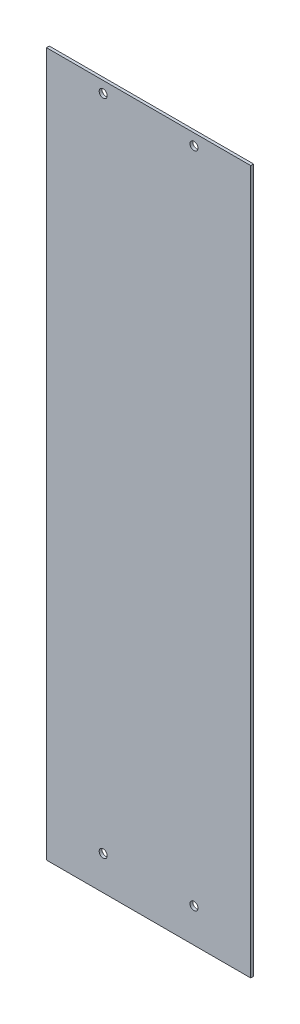
ISO-10303-21;
HEADER;
FILE_DESCRIPTION(('STEP AP214'),'2;1');
FILE_NAME('part.step','',(''),(''),'','','');
FILE_SCHEMA(('AUTOMOTIVE_DESIGN { 1 0 10303 214 1 1 1 1 }'));
ENDSEC;
DATA;
#1=APPLICATION_CONTEXT('core data for automotive mechanical design processes');
#2=APPLICATION_PROTOCOL_DEFINITION('international standard','automotive_design',2000,#1);
#3=PRODUCT_CONTEXT('',#1,'mechanical');
#4=PRODUCT('Part','Part','',(#3));
#5=PRODUCT_RELATED_PRODUCT_CATEGORY('part','',(#4));
#6=PRODUCT_DEFINITION_FORMATION('','',#4);
#7=PRODUCT_DEFINITION_CONTEXT('part definition',#1,'design');
#8=PRODUCT_DEFINITION('design','',#6,#7);
#9=PRODUCT_DEFINITION_SHAPE('','',#8);
#10=(LENGTH_UNIT() NAMED_UNIT(*) SI_UNIT(.MILLI.,.METRE.));
#11=(NAMED_UNIT(*) PLANE_ANGLE_UNIT() SI_UNIT($,.RADIAN.));
#12=(NAMED_UNIT(*) SI_UNIT($,.STERADIAN.) SOLID_ANGLE_UNIT());
#13=UNCERTAINTY_MEASURE_WITH_UNIT(LENGTH_MEASURE(1.E-05),#10,'distance_accuracy_value','');
#14=(GEOMETRIC_REPRESENTATION_CONTEXT(3) GLOBAL_UNCERTAINTY_ASSIGNED_CONTEXT((#13)) GLOBAL_UNIT_ASSIGNED_CONTEXT((#10,
#11,#12)) REPRESENTATION_CONTEXT('',''));
#15=CARTESIAN_POINT('',(0.,0.,0.));
#16=DIRECTION('',(0.,0.,1.));
#17=DIRECTION('',(1.,0.,0.));
#18=AXIS2_PLACEMENT_3D('',#15,#16,#17);
#19=CARTESIAN_POINT('',(0.,0.,1.5875));
#20=DIRECTION('',(0.,0.,-1.));
#21=DIRECTION('',(-1.,0.,0.));
#22=AXIS2_PLACEMENT_3D('',#19,#20,#21);
#23=PLANE('',#22);
#24=DIRECTION('',(0.,-1.,0.));
#25=VECTOR('',#24,1.);
#26=CARTESIAN_POINT('',(0.,0.,1.5875));
#27=LINE('',#26,#25);
#28=CARTESIAN_POINT('',(0.,393.7,1.5875));
#29=VERTEX_POINT('',#28);
#30=CARTESIAN_POINT('',(0.,0.,1.5875));
#31=VERTEX_POINT('',#30);
#32=EDGE_CURVE('E89',#29,#31,#27,.T.);
#33=ORIENTED_EDGE('',*,*,#32,.T.);
#34=DIRECTION('',(1.,0.,0.));
#35=VECTOR('',#34,1.);
#36=CARTESIAN_POINT('',(0.,0.,1.5875));
#37=LINE('',#36,#35);
#38=CARTESIAN_POINT('',(114.3,0.,1.5875));
#39=VERTEX_POINT('',#38);
#40=EDGE_CURVE('E84',#31,#39,#37,.T.);
#41=ORIENTED_EDGE('',*,*,#40,.T.);
#42=DIRECTION('',(0.,1.,0.));
#43=VECTOR('',#42,1.);
#44=CARTESIAN_POINT('',(114.3,0.,1.5875));
#45=LINE('',#44,#43);
#46=CARTESIAN_POINT('',(114.3,393.7,1.5875));
#47=VERTEX_POINT('',#46);
#48=EDGE_CURVE('E87',#39,#47,#45,.T.);
#49=ORIENTED_EDGE('',*,*,#48,.T.);
#50=DIRECTION('',(-1.,0.,0.));
#51=VECTOR('',#50,1.);
#52=CARTESIAN_POINT('',(0.,393.7,1.5875));
#53=LINE('',#52,#51);
#54=EDGE_CURVE('E54',#47,#29,#53,.T.);
#55=ORIENTED_EDGE('',*,*,#54,.T.);
#56=EDGE_LOOP('',(#33,#41,#49,#55));
#57=FACE_BOUND('',#56,.T.);
#58=CARTESIAN_POINT('',(31.75,387.35,1.5875));
#59=DIRECTION('',(0.,0.,1.));
#60=DIRECTION('',(1.,0.,0.));
#61=AXIS2_PLACEMENT_3D('',#58,#59,#60);
#62=CIRCLE('',#61,2.25);
#63=CARTESIAN_POINT('',(34.,387.35,1.5875));
#64=VERTEX_POINT('',#63);
#65=EDGE_CURVE('E104',#64,#64,#62,.T.);
#66=ORIENTED_EDGE('',*,*,#65,.F.);
#67=EDGE_LOOP('',(#66));
#68=FACE_BOUND('',#67,.T.);
#69=CARTESIAN_POINT('',(82.55,387.35,1.5875));
#70=DIRECTION('',(0.,0.,1.));
#71=DIRECTION('',(1.,0.,0.));
#72=AXIS2_PLACEMENT_3D('',#69,#70,#71);
#73=CIRCLE('',#72,2.25);
#74=CARTESIAN_POINT('',(84.8,387.35,1.5875));
#75=VERTEX_POINT('',#74);
#76=EDGE_CURVE('E119',#75,#75,#73,.T.);
#77=ORIENTED_EDGE('',*,*,#76,.F.);
#78=EDGE_LOOP('',(#77));
#79=FACE_BOUND('',#78,.T.);
#80=CARTESIAN_POINT('',(31.75,19.05,1.5875));
#81=DIRECTION('',(0.,0.,1.));
#82=DIRECTION('',(1.,0.,0.));
#83=AXIS2_PLACEMENT_3D('',#80,#81,#82);
#84=CIRCLE('',#83,2.25);
#85=CARTESIAN_POINT('',(34.,19.05,1.5875));
#86=VERTEX_POINT('',#85);
#87=EDGE_CURVE('E125',#86,#86,#84,.T.);
#88=ORIENTED_EDGE('',*,*,#87,.F.);
#89=EDGE_LOOP('',(#88));
#90=FACE_BOUND('',#89,.T.);
#91=CARTESIAN_POINT('',(82.55,19.05,1.5875));
#92=DIRECTION('',(0.,0.,1.));
#93=DIRECTION('',(1.,0.,0.));
#94=AXIS2_PLACEMENT_3D('',#91,#92,#93);
#95=CIRCLE('',#94,2.25);
#96=CARTESIAN_POINT('',(84.8,19.05,1.5875));
#97=VERTEX_POINT('',#96);
#98=EDGE_CURVE('E131',#97,#97,#95,.T.);
#99=ORIENTED_EDGE('',*,*,#98,.F.);
#100=EDGE_LOOP('',(#99));
#101=FACE_BOUND('',#100,.T.);
#102=ADVANCED_FACE('F37',(#57,#68,#79,#90,#101),#23,.F.);
#103=CARTESIAN_POINT('',(0.,0.,0.));
#104=DIRECTION('',(0.,0.,-1.));
#105=DIRECTION('',(-1.,0.,0.));
#106=AXIS2_PLACEMENT_3D('',#103,#104,#105);
#107=PLANE('',#106);
#108=CARTESIAN_POINT('',(31.75,19.05,0.));
#109=DIRECTION('',(0.,0.,1.));
#110=DIRECTION('',(1.,0.,0.));
#111=AXIS2_PLACEMENT_3D('',#108,#109,#110);
#112=CIRCLE('',#111,2.25);
#113=CARTESIAN_POINT('',(34.,19.05,0.));
#114=VERTEX_POINT('',#113);
#115=EDGE_CURVE('E128',#114,#114,#112,.T.);
#116=ORIENTED_EDGE('',*,*,#115,.T.);
#117=EDGE_LOOP('',(#116));
#118=FACE_BOUND('',#117,.T.);
#119=CARTESIAN_POINT('',(31.75,387.35,0.));
#120=DIRECTION('',(0.,0.,1.));
#121=DIRECTION('',(1.,0.,0.));
#122=AXIS2_PLACEMENT_3D('',#119,#120,#121);
#123=CIRCLE('',#122,2.25);
#124=CARTESIAN_POINT('',(34.,387.35,0.));
#125=VERTEX_POINT('',#124);
#126=EDGE_CURVE('E116',#125,#125,#123,.T.);
#127=ORIENTED_EDGE('',*,*,#126,.T.);
#128=EDGE_LOOP('',(#127));
#129=FACE_BOUND('',#128,.T.);
#130=DIRECTION('',(0.,-1.,0.));
#131=VECTOR('',#130,1.);
#132=CARTESIAN_POINT('',(0.,0.,0.));
#133=LINE('',#132,#131);
#134=CARTESIAN_POINT('',(0.,393.7,0.));
#135=VERTEX_POINT('',#134);
#136=CARTESIAN_POINT('',(0.,0.,0.));
#137=VERTEX_POINT('',#136);
#138=EDGE_CURVE('E101',#135,#137,#133,.T.);
#139=ORIENTED_EDGE('',*,*,#138,.F.);
#140=DIRECTION('',(-1.,0.,0.));
#141=VECTOR('',#140,1.);
#142=CARTESIAN_POINT('',(0.,393.7,0.));
#143=LINE('',#142,#141);
#144=CARTESIAN_POINT('',(114.3,393.7,0.));
#145=VERTEX_POINT('',#144);
#146=EDGE_CURVE('E77',#145,#135,#143,.T.);
#147=ORIENTED_EDGE('',*,*,#146,.F.);
#148=DIRECTION('',(0.,1.,0.));
#149=VECTOR('',#148,1.);
#150=CARTESIAN_POINT('',(114.3,0.,0.));
#151=LINE('',#150,#149);
#152=CARTESIAN_POINT('',(114.3,0.,0.));
#153=VERTEX_POINT('',#152);
#154=EDGE_CURVE('E71',#153,#145,#151,.T.);
#155=ORIENTED_EDGE('',*,*,#154,.F.);
#156=DIRECTION('',(1.,0.,0.));
#157=VECTOR('',#156,1.);
#158=CARTESIAN_POINT('',(0.,0.,0.));
#159=LINE('',#158,#157);
#160=EDGE_CURVE('E93',#137,#153,#159,.T.);
#161=ORIENTED_EDGE('',*,*,#160,.F.);
#162=EDGE_LOOP('',(#139,#147,#155,#161));
#163=FACE_BOUND('',#162,.T.);
#164=CARTESIAN_POINT('',(82.55,387.35,0.));
#165=DIRECTION('',(0.,0.,1.));
#166=DIRECTION('',(1.,0.,0.));
#167=AXIS2_PLACEMENT_3D('',#164,#165,#166);
#168=CIRCLE('',#167,2.25);
#169=CARTESIAN_POINT('',(84.8,387.35,0.));
#170=VERTEX_POINT('',#169);
#171=EDGE_CURVE('E122',#170,#170,#168,.T.);
#172=ORIENTED_EDGE('',*,*,#171,.T.);
#173=EDGE_LOOP('',(#172));
#174=FACE_BOUND('',#173,.T.);
#175=CARTESIAN_POINT('',(82.55,19.05,0.));
#176=DIRECTION('',(0.,0.,1.));
#177=DIRECTION('',(1.,0.,0.));
#178=AXIS2_PLACEMENT_3D('',#175,#176,#177);
#179=CIRCLE('',#178,2.25);
#180=CARTESIAN_POINT('',(84.8,19.05,0.));
#181=VERTEX_POINT('',#180);
#182=EDGE_CURVE('E134',#181,#181,#179,.T.);
#183=ORIENTED_EDGE('',*,*,#182,.T.);
#184=EDGE_LOOP('',(#183));
#185=FACE_BOUND('',#184,.T.);
#186=ADVANCED_FACE('F112',(#118,#129,#163,#174,#185),#107,.T.);
#187=CARTESIAN_POINT('',(0.,0.,1.5875));
#188=DIRECTION('',(1.,0.,0.));
#189=DIRECTION('',(0.,0.,-1.));
#190=AXIS2_PLACEMENT_3D('',#187,#188,#189);
#191=PLANE('',#190);
#192=ORIENTED_EDGE('',*,*,#138,.T.);
#193=DIRECTION('',(0.,0.,-1.));
#194=VECTOR('',#193,1.);
#195=CARTESIAN_POINT('',(0.,0.,1.5875));
#196=LINE('',#195,#194);
#197=EDGE_CURVE('E11',#31,#137,#196,.T.);
#198=ORIENTED_EDGE('',*,*,#197,.F.);
#199=ORIENTED_EDGE('',*,*,#32,.F.);
#200=DIRECTION('',(0.,0.,-1.));
#201=VECTOR('',#200,1.);
#202=CARTESIAN_POINT('',(0.,393.7,1.5875));
#203=LINE('',#202,#201);
#204=EDGE_CURVE('E97',#29,#135,#203,.T.);
#205=ORIENTED_EDGE('',*,*,#204,.T.);
#206=EDGE_LOOP('',(#192,#198,#199,#205));
#207=FACE_BOUND('',#206,.T.);
#208=ADVANCED_FACE('F39',(#207),#191,.F.);
#209=CARTESIAN_POINT('',(0.,0.,1.5875));
#210=DIRECTION('',(0.,1.,0.));
#211=DIRECTION('',(0.,0.,1.));
#212=AXIS2_PLACEMENT_3D('',#209,#210,#211);
#213=PLANE('',#212);
#214=ORIENTED_EDGE('',*,*,#160,.T.);
#215=DIRECTION('',(0.,0.,-1.));
#216=VECTOR('',#215,1.);
#217=CARTESIAN_POINT('',(114.3,0.,1.5875));
#218=LINE('',#217,#216);
#219=EDGE_CURVE('E46',#39,#153,#218,.T.);
#220=ORIENTED_EDGE('',*,*,#219,.F.);
#221=ORIENTED_EDGE('',*,*,#40,.F.);
#222=ORIENTED_EDGE('',*,*,#197,.T.);
#223=EDGE_LOOP('',(#214,#220,#221,#222));
#224=FACE_BOUND('',#223,.T.);
#225=ADVANCED_FACE('F92',(#224),#213,.F.);
#226=CARTESIAN_POINT('',(114.3,0.,1.5875));
#227=DIRECTION('',(-1.,0.,0.));
#228=DIRECTION('',(0.,0.,1.));
#229=AXIS2_PLACEMENT_3D('',#226,#227,#228);
#230=PLANE('',#229);
#231=ORIENTED_EDGE('',*,*,#154,.T.);
#232=DIRECTION('',(0.,0.,-1.));
#233=VECTOR('',#232,1.);
#234=CARTESIAN_POINT('',(114.3,393.7,1.5875));
#235=LINE('',#234,#233);
#236=EDGE_CURVE('E94',#47,#145,#235,.T.);
#237=ORIENTED_EDGE('',*,*,#236,.F.);
#238=ORIENTED_EDGE('',*,*,#48,.F.);
#239=ORIENTED_EDGE('',*,*,#219,.T.);
#240=EDGE_LOOP('',(#231,#237,#238,#239));
#241=FACE_BOUND('',#240,.T.);
#242=ADVANCED_FACE('F95',(#241),#230,.F.);
#243=CARTESIAN_POINT('',(0.,393.7,1.5875));
#244=DIRECTION('',(0.,-1.,0.));
#245=DIRECTION('',(0.,0.,-1.));
#246=AXIS2_PLACEMENT_3D('',#243,#244,#245);
#247=PLANE('',#246);
#248=ORIENTED_EDGE('',*,*,#146,.T.);
#249=ORIENTED_EDGE('',*,*,#204,.F.);
#250=ORIENTED_EDGE('',*,*,#54,.F.);
#251=ORIENTED_EDGE('',*,*,#236,.T.);
#252=EDGE_LOOP('',(#248,#249,#250,#251));
#253=FACE_BOUND('',#252,.T.);
#254=ADVANCED_FACE('F109',(#253),#247,.F.);
#255=CARTESIAN_POINT('',(31.75,387.35,1.5875));
#256=DIRECTION('',(0.,0.,-1.));
#257=DIRECTION('',(-1.,0.,0.));
#258=AXIS2_PLACEMENT_3D('',#255,#256,#257);
#259=CYLINDRICAL_SURFACE('',#258,2.25);
#260=ORIENTED_EDGE('',*,*,#65,.T.);
#261=EDGE_LOOP('',(#260));
#262=FACE_BOUND('',#261,.T.);
#263=ORIENTED_EDGE('',*,*,#126,.F.);
#264=EDGE_LOOP('',(#263));
#265=FACE_BOUND('',#264,.T.);
#266=ADVANCED_FACE('F151',(#262,#265),#259,.F.);
#267=CARTESIAN_POINT('',(82.55,387.35,1.5875));
#268=DIRECTION('',(0.,0.,-1.));
#269=DIRECTION('',(-1.,0.,0.));
#270=AXIS2_PLACEMENT_3D('',#267,#268,#269);
#271=CYLINDRICAL_SURFACE('',#270,2.25);
#272=ORIENTED_EDGE('',*,*,#76,.T.);
#273=EDGE_LOOP('',(#272));
#274=FACE_BOUND('',#273,.T.);
#275=ORIENTED_EDGE('',*,*,#171,.F.);
#276=EDGE_LOOP('',(#275));
#277=FACE_BOUND('',#276,.T.);
#278=ADVANCED_FACE('F197',(#274,#277),#271,.F.);
#279=CARTESIAN_POINT('',(31.75,19.05,1.5875));
#280=DIRECTION('',(0.,0.,-1.));
#281=DIRECTION('',(-1.,0.,0.));
#282=AXIS2_PLACEMENT_3D('',#279,#280,#281);
#283=CYLINDRICAL_SURFACE('',#282,2.25);
#284=ORIENTED_EDGE('',*,*,#87,.T.);
#285=EDGE_LOOP('',(#284));
#286=FACE_BOUND('',#285,.T.);
#287=ORIENTED_EDGE('',*,*,#115,.F.);
#288=EDGE_LOOP('',(#287));
#289=FACE_BOUND('',#288,.T.);
#290=ADVANCED_FACE('F205',(#286,#289),#283,.F.);
#291=CARTESIAN_POINT('',(82.55,19.05,1.5875));
#292=DIRECTION('',(0.,0.,-1.));
#293=DIRECTION('',(-1.,0.,0.));
#294=AXIS2_PLACEMENT_3D('',#291,#292,#293);
#295=CYLINDRICAL_SURFACE('',#294,2.25);
#296=ORIENTED_EDGE('',*,*,#98,.T.);
#297=EDGE_LOOP('',(#296));
#298=FACE_BOUND('',#297,.T.);
#299=ORIENTED_EDGE('',*,*,#182,.F.);
#300=EDGE_LOOP('',(#299));
#301=FACE_BOUND('',#300,.T.);
#302=ADVANCED_FACE('F140',(#298,#301),#295,.F.);
#303=CLOSED_SHELL('',(#102,#186,#208,#225,#242,#254,#266,#278,#290,#302));
#304=MANIFOLD_SOLID_BREP('B2',#303);
#305=ADVANCED_BREP_SHAPE_REPRESENTATION('',(#18,#304),#14);
#306=SHAPE_DEFINITION_REPRESENTATION(#9,#305);
ENDSEC;
END-ISO-10303-21;
